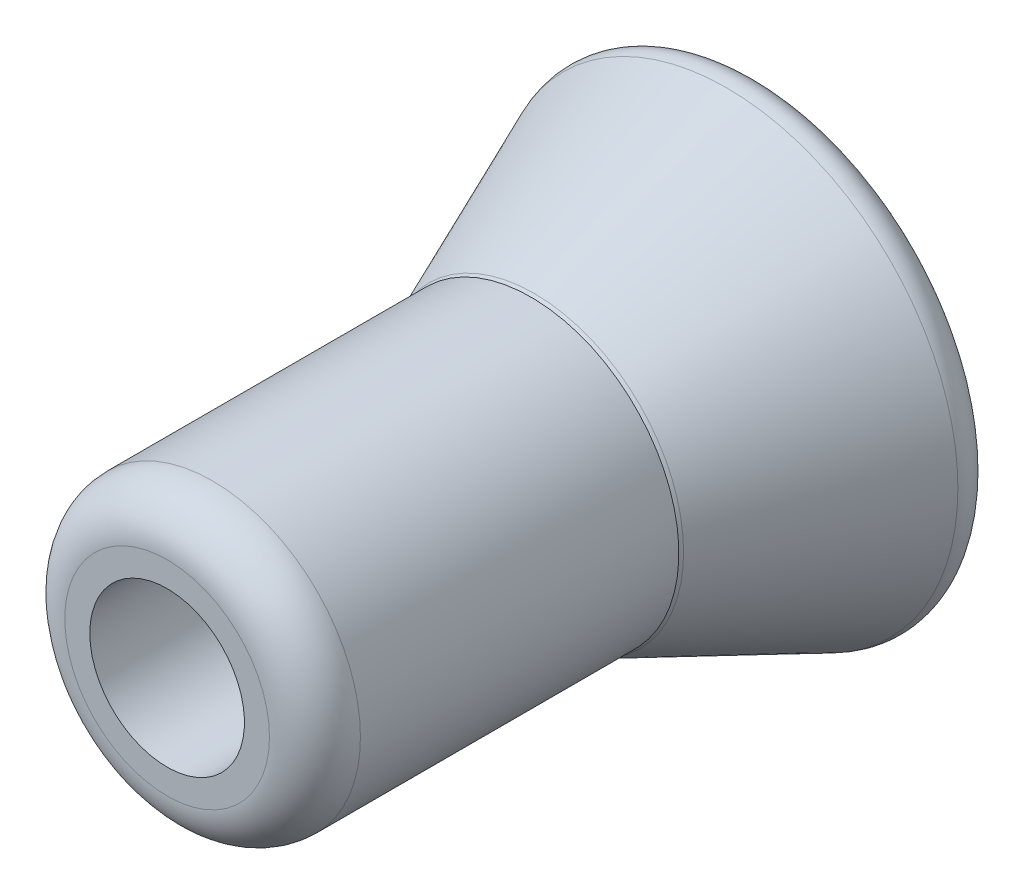
ISO-10303-21;
HEADER;
FILE_DESCRIPTION(('STEP AP214'),'2;1');
FILE_NAME('part.step','',(''),(''),'','','');
FILE_SCHEMA(('AUTOMOTIVE_DESIGN { 1 0 10303 214 1 1 1 1 }'));
ENDSEC;
DATA;
#1=APPLICATION_CONTEXT('core data for automotive mechanical design processes');
#2=APPLICATION_PROTOCOL_DEFINITION('international standard','automotive_design',2000,#1);
#3=PRODUCT_CONTEXT('',#1,'mechanical');
#4=PRODUCT('Part','Part','',(#3));
#5=PRODUCT_RELATED_PRODUCT_CATEGORY('part','',(#4));
#6=PRODUCT_DEFINITION_FORMATION('','',#4);
#7=PRODUCT_DEFINITION_CONTEXT('part definition',#1,'design');
#8=PRODUCT_DEFINITION('design','',#6,#7);
#9=PRODUCT_DEFINITION_SHAPE('','',#8);
#10=(LENGTH_UNIT() NAMED_UNIT(*) SI_UNIT(.MILLI.,.METRE.));
#11=(NAMED_UNIT(*) PLANE_ANGLE_UNIT() SI_UNIT($,.RADIAN.));
#12=(NAMED_UNIT(*) SI_UNIT($,.STERADIAN.) SOLID_ANGLE_UNIT());
#13=UNCERTAINTY_MEASURE_WITH_UNIT(LENGTH_MEASURE(1.E-05),#10,'distance_accuracy_value','');
#14=(GEOMETRIC_REPRESENTATION_CONTEXT(3) GLOBAL_UNCERTAINTY_ASSIGNED_CONTEXT((#13)) GLOBAL_UNIT_ASSIGNED_CONTEXT((#10,
#11,#12)) REPRESENTATION_CONTEXT('',''));
#15=CARTESIAN_POINT('',(0.,0.,0.));
#16=DIRECTION('',(0.,0.,1.));
#17=DIRECTION('',(1.,0.,0.));
#18=AXIS2_PLACEMENT_3D('',#15,#16,#17);
#19=CARTESIAN_POINT('',(0.,0.,13.));
#20=DIRECTION('',(0.,0.,-1.));
#21=DIRECTION('',(-1.,0.,0.));
#22=AXIS2_PLACEMENT_3D('',#19,#20,#21);
#23=CYLINDRICAL_SURFACE('',#22,3.25);
#24=CARTESIAN_POINT('',(0.,0.,12.));
#25=DIRECTION('',(0.,0.,1.));
#26=DIRECTION('',(1.,0.,0.));
#27=AXIS2_PLACEMENT_3D('',#24,#25,#26);
#28=CIRCLE('',#27,3.25);
#29=CARTESIAN_POINT('',(-3.25,0.,12.));
#30=VERTEX_POINT('',#29);
#31=EDGE_CURVE('E52',#30,#30,#28,.F.);
#32=CARTESIAN_POINT('',(0.,0.,5.));
#33=DIRECTION('',(0.,0.,-1.));
#34=DIRECTION('',(-1.,0.,0.));
#35=AXIS2_PLACEMENT_3D('',#32,#33,#34);
#36=CIRCLE('',#35,3.25);
#37=CARTESIAN_POINT('',(-3.25,0.,5.));
#38=VERTEX_POINT('',#37);
#39=EDGE_CURVE('E60',#38,#38,#36,.T.);
#40=CARTESIAN_POINT('',(-3.25,0.,12.));
#41=CARTESIAN_POINT('',(-3.25,0.,11.9270833333333));
#42=CARTESIAN_POINT('',(-3.25,0.,11.8541666666667));
#43=CARTESIAN_POINT('',(-3.25,0.,11.7083333333333));
#44=CARTESIAN_POINT('',(-3.25,0.,11.6354166666667));
#45=CARTESIAN_POINT('',(-3.25,0.,11.4895833333333));
#46=CARTESIAN_POINT('',(-3.25,0.,11.4166666666667));
#47=CARTESIAN_POINT('',(-3.25,0.,11.2708333333333));
#48=CARTESIAN_POINT('',(-3.25,0.,11.1979166666667));
#49=CARTESIAN_POINT('',(-3.25,0.,11.0520833333333));
#50=CARTESIAN_POINT('',(-3.25,0.,10.9791666666667));
#51=CARTESIAN_POINT('',(-3.25,0.,10.8333333333333));
#52=CARTESIAN_POINT('',(-3.25,0.,10.7604166666667));
#53=CARTESIAN_POINT('',(-3.25,0.,10.6145833333333));
#54=CARTESIAN_POINT('',(-3.25,0.,10.5416666666667));
#55=CARTESIAN_POINT('',(-3.25,0.,10.3958333333333));
#56=CARTESIAN_POINT('',(-3.25,0.,10.3229166666667));
#57=CARTESIAN_POINT('',(-3.25,0.,10.1770833333333));
#58=CARTESIAN_POINT('',(-3.25,0.,10.1041666666667));
#59=CARTESIAN_POINT('',(-3.25,0.,9.95833333333333));
#60=CARTESIAN_POINT('',(-3.25,0.,9.88541666666667));
#61=CARTESIAN_POINT('',(-3.25,0.,9.73958333333333));
#62=CARTESIAN_POINT('',(-3.25,0.,9.66666666666667));
#63=CARTESIAN_POINT('',(-3.25,0.,9.52083333333333));
#64=CARTESIAN_POINT('',(-3.25,0.,9.44791666666667));
#65=CARTESIAN_POINT('',(-3.25,0.,9.30208333333333));
#66=CARTESIAN_POINT('',(-3.25,0.,9.22916666666667));
#67=CARTESIAN_POINT('',(-3.25,0.,9.08333333333333));
#68=CARTESIAN_POINT('',(-3.25,0.,9.01041666666667));
#69=CARTESIAN_POINT('',(-3.25,0.,8.86458333333333));
#70=CARTESIAN_POINT('',(-3.25,0.,8.79166666666667));
#71=CARTESIAN_POINT('',(-3.25,0.,8.64583333333333));
#72=CARTESIAN_POINT('',(-3.25,0.,8.57291666666667));
#73=CARTESIAN_POINT('',(-3.25,0.,8.42708333333333));
#74=CARTESIAN_POINT('',(-3.25,0.,8.35416666666667));
#75=CARTESIAN_POINT('',(-3.25,0.,8.20833333333333));
#76=CARTESIAN_POINT('',(-3.25,0.,8.13541666666667));
#77=CARTESIAN_POINT('',(-3.25,0.,7.98958333333333));
#78=CARTESIAN_POINT('',(-3.25,0.,7.91666666666667));
#79=CARTESIAN_POINT('',(-3.25,0.,7.77083333333333));
#80=CARTESIAN_POINT('',(-3.25,0.,7.69791666666667));
#81=CARTESIAN_POINT('',(-3.25,0.,7.55208333333333));
#82=CARTESIAN_POINT('',(-3.25,0.,7.47916666666667));
#83=CARTESIAN_POINT('',(-3.25,0.,7.33333333333333));
#84=CARTESIAN_POINT('',(-3.25,0.,7.26041666666667));
#85=CARTESIAN_POINT('',(-3.25,0.,7.11458333333333));
#86=CARTESIAN_POINT('',(-3.25,0.,7.04166666666667));
#87=CARTESIAN_POINT('',(-3.25,0.,6.89583333333333));
#88=CARTESIAN_POINT('',(-3.25,0.,6.82291666666667));
#89=CARTESIAN_POINT('',(-3.25,0.,6.67708333333333));
#90=CARTESIAN_POINT('',(-3.25,0.,6.60416666666667));
#91=CARTESIAN_POINT('',(-3.25,0.,6.45833333333333));
#92=CARTESIAN_POINT('',(-3.25,0.,6.38541666666667));
#93=CARTESIAN_POINT('',(-3.25,0.,6.23958333333333));
#94=CARTESIAN_POINT('',(-3.25,0.,6.16666666666667));
#95=CARTESIAN_POINT('',(-3.25,0.,6.02083333333333));
#96=CARTESIAN_POINT('',(-3.25,0.,5.94791666666667));
#97=CARTESIAN_POINT('',(-3.25,0.,5.80208333333333));
#98=CARTESIAN_POINT('',(-3.25,0.,5.72916666666667));
#99=CARTESIAN_POINT('',(-3.25,0.,5.58333333333333));
#100=CARTESIAN_POINT('',(-3.25,0.,5.51041666666667));
#101=CARTESIAN_POINT('',(-3.25,0.,5.36458333333333));
#102=CARTESIAN_POINT('',(-3.25,0.,5.29166666666667));
#103=CARTESIAN_POINT('',(-3.25,0.,5.14583333333333));
#104=CARTESIAN_POINT('',(-3.25,0.,5.07291666666667));
#105=CARTESIAN_POINT('',(-3.25,0.,5.));
#106=B_SPLINE_CURVE_WITH_KNOTS('',3,(#40,#41,#42,#43,#44,#45,#46,#47,#48,#49,#50,#51,#52,#53,
#54,#55,#56,#57,#58,#59,#60,#61,#62,#63,#64,#65,#66,#67,#68,#69,#70,#71,#72,#73,#74,#75,#76,#77,
#78,#79,#80,#81,#82,#83,#84,#85,#86,#87,#88,#89,#90,#91,#92,#93,#94,#95,#96,#97,#98,#99,#100,
#101,#102,#103,#104,#105),.UNSPECIFIED.,.F.,.F.,(4,2,2,2,2,2,2,2,2,2,2,2,2,2,2,2,2,2,2,2,2,2,2,
2,2,2,2,2,2,2,2,2,4),(0.,0.218749999999998,0.437499999999999,0.656249999999999,
0.874999999999999,1.09375,1.3125,1.53125,1.75,1.96875,2.1875,2.40625,2.625,2.84375,3.0625,
3.28125,3.5,3.71875,3.9375,4.15625,4.375,4.59375,4.8125,5.03125,5.25,5.46875,5.6875,5.90625,
6.125,6.34375,6.5625,6.78125,7.),.UNSPECIFIED.);
#107=EDGE_CURVE('BSEAM37',#30,#38,#106,.T.);
#108=ORIENTED_EDGE('',*,*,#31,.T.);
#109=ORIENTED_EDGE('',*,*,#39,.F.);
#110=ORIENTED_EDGE('',*,*,#107,.T.);
#111=ORIENTED_EDGE('',*,*,#107,.F.);
#112=EDGE_LOOP('',(#108,#110,#109,#111));
#113=FACE_BOUND('',#112,.T.);
#114=ADVANCED_FACE('F37',(#113),#23,.T.);
#115=CARTESIAN_POINT('',(0.,0.,13.));
#116=DIRECTION('',(0.,0.,1.));
#117=DIRECTION('',(1.,0.,0.));
#118=AXIS2_PLACEMENT_3D('',#115,#116,#117);
#119=PLANE('',#118);
#120=CARTESIAN_POINT('',(0.,0.,13.));
#121=DIRECTION('',(0.,0.,1.));
#122=DIRECTION('',(1.,0.,0.));
#123=AXIS2_PLACEMENT_3D('',#120,#121,#122);
#124=CIRCLE('',#123,2.25);
#125=CARTESIAN_POINT('',(2.25,0.,13.));
#126=VERTEX_POINT('',#125);
#127=EDGE_CURVE('E57',#126,#126,#124,.T.);
#128=ORIENTED_EDGE('',*,*,#127,.T.);
#129=EDGE_LOOP('',(#128));
#130=FACE_BOUND('',#129,.T.);
#131=CARTESIAN_POINT('',(0.,0.,13.));
#132=DIRECTION('',(0.,0.,-1.));
#133=DIRECTION('',(-1.,0.,0.));
#134=AXIS2_PLACEMENT_3D('',#131,#132,#133);
#135=CIRCLE('',#134,1.7);
#136=CARTESIAN_POINT('',(-1.7,0.,13.));
#137=VERTEX_POINT('',#136);
#138=EDGE_CURVE('E63',#137,#137,#135,.T.);
#139=ORIENTED_EDGE('',*,*,#138,.T.);
#140=EDGE_LOOP('',(#139));
#141=FACE_BOUND('',#140,.T.);
#142=ADVANCED_FACE('F70',(#130,#141),#119,.T.);
#143=CARTESIAN_POINT('',(0.,0.,0.));
#144=DIRECTION('',(0.,0.,-1.));
#145=DIRECTION('',(-1.,0.,0.));
#146=AXIS2_PLACEMENT_3D('',#143,#144,#145);
#147=CONICAL_SURFACE('',#146,5.37575896824603,0.401425727958697);
#148=CARTESIAN_POINT('',(0.,0.,4.92860890874563));
#149=DIRECTION('',(0.,0.,-1.));
#150=DIRECTION('',(-1.,0.,0.));
#151=AXIS2_PLACEMENT_3D('',#148,#149,#150);
#152=CIRCLE('',#151,3.2836886075372);
#153=CARTESIAN_POINT('',(-3.2836886075372,0.,4.92860890874563));
#154=VERTEX_POINT('',#153);
#155=EDGE_CURVE('E10',#154,#154,#152,.T.);
#156=ORIENTED_EDGE('',*,*,#155,.T.);
#157=EDGE_LOOP('',(#156));
#158=FACE_BOUND('',#157,.T.);
#159=CARTESIAN_POINT('',(0.,0.,0.695365564244637));
#160=DIRECTION('',(0.,0.,-1.));
#161=DIRECTION('',(-1.,0.,0.));
#162=AXIS2_PLACEMENT_3D('',#159,#160,#161);
#163=CIRCLE('',#162,5.08059379816479);
#164=CARTESIAN_POINT('',(-5.08059379816479,0.,0.695365564244637));
#165=VERTEX_POINT('',#164);
#166=EDGE_CURVE('E44',#165,#165,#163,.F.);
#167=ORIENTED_EDGE('',*,*,#166,.T.);
#168=EDGE_LOOP('',(#167));
#169=FACE_BOUND('',#168,.T.);
#170=ADVANCED_FACE('F81',(#158,#169),#147,.T.);
#171=CARTESIAN_POINT('',(0.,0.,0.));
#172=DIRECTION('',(0.,0.,1.));
#173=DIRECTION('',(1.,0.,0.));
#174=AXIS2_PLACEMENT_3D('',#171,#172,#173);
#175=PLANE('',#174);
#176=CARTESIAN_POINT('',(0.,0.,0.));
#177=DIRECTION('',(0.,0.,1.));
#178=DIRECTION('',(1.,0.,0.));
#179=AXIS2_PLACEMENT_3D('',#176,#177,#178);
#180=CIRCLE('',#179,4.62034137143857);
#181=CARTESIAN_POINT('',(4.62034137143857,0.,0.));
#182=VERTEX_POINT('',#181);
#183=EDGE_CURVE('E48',#182,#182,#180,.F.);
#184=ORIENTED_EDGE('',*,*,#183,.T.);
#185=EDGE_LOOP('',(#184));
#186=FACE_BOUND('',#185,.T.);
#187=CARTESIAN_POINT('',(0.,0.,0.));
#188=DIRECTION('',(0.,0.,-1.));
#189=DIRECTION('',(-1.,0.,0.));
#190=AXIS2_PLACEMENT_3D('',#187,#188,#189);
#191=CIRCLE('',#190,1.7);
#192=CARTESIAN_POINT('',(-1.7,0.,0.));
#193=VERTEX_POINT('',#192);
#194=EDGE_CURVE('E64',#193,#193,#191,.T.);
#195=ORIENTED_EDGE('',*,*,#194,.F.);
#196=EDGE_LOOP('',(#195));
#197=FACE_BOUND('',#196,.T.);
#198=ADVANCED_FACE('F76',(#186,#197),#175,.F.);
#199=CARTESIAN_POINT('',(0.,0.,13.));
#200=DIRECTION('',(0.,0.,-1.));
#201=DIRECTION('',(-1.,0.,0.));
#202=AXIS2_PLACEMENT_3D('',#199,#200,#201);
#203=CYLINDRICAL_SURFACE('',#202,1.7);
#204=CARTESIAN_POINT('',(-1.7,0.,13.));
#205=CARTESIAN_POINT('',(-1.7,0.,12.8645833333333));
#206=CARTESIAN_POINT('',(-1.7,0.,12.7291666666667));
#207=CARTESIAN_POINT('',(-1.7,0.,12.4583333333333));
#208=CARTESIAN_POINT('',(-1.7,0.,12.3229166666667));
#209=CARTESIAN_POINT('',(-1.7,0.,12.0520833333333));
#210=CARTESIAN_POINT('',(-1.7,0.,11.9166666666667));
#211=CARTESIAN_POINT('',(-1.7,0.,11.6458333333333));
#212=CARTESIAN_POINT('',(-1.7,0.,11.5104166666667));
#213=CARTESIAN_POINT('',(-1.7,0.,11.2395833333333));
#214=CARTESIAN_POINT('',(-1.7,0.,11.1041666666667));
#215=CARTESIAN_POINT('',(-1.7,0.,10.8333333333333));
#216=CARTESIAN_POINT('',(-1.7,0.,10.6979166666667));
#217=CARTESIAN_POINT('',(-1.7,0.,10.4270833333333));
#218=CARTESIAN_POINT('',(-1.7,0.,10.2916666666667));
#219=CARTESIAN_POINT('',(-1.7,0.,10.0208333333333));
#220=CARTESIAN_POINT('',(-1.7,0.,9.88541666666667));
#221=CARTESIAN_POINT('',(-1.7,0.,9.61458333333333));
#222=CARTESIAN_POINT('',(-1.7,0.,9.47916666666667));
#223=CARTESIAN_POINT('',(-1.7,0.,9.20833333333333));
#224=CARTESIAN_POINT('',(-1.7,0.,9.07291666666667));
#225=CARTESIAN_POINT('',(-1.7,0.,8.80208333333333));
#226=CARTESIAN_POINT('',(-1.7,0.,8.66666666666667));
#227=CARTESIAN_POINT('',(-1.7,0.,8.39583333333333));
#228=CARTESIAN_POINT('',(-1.7,0.,8.26041666666667));
#229=CARTESIAN_POINT('',(-1.7,0.,7.98958333333333));
#230=CARTESIAN_POINT('',(-1.7,0.,7.85416666666667));
#231=CARTESIAN_POINT('',(-1.7,0.,7.58333333333333));
#232=CARTESIAN_POINT('',(-1.7,0.,7.44791666666667));
#233=CARTESIAN_POINT('',(-1.7,0.,7.17708333333333));
#234=CARTESIAN_POINT('',(-1.7,0.,7.04166666666667));
#235=CARTESIAN_POINT('',(-1.7,0.,6.77083333333333));
#236=CARTESIAN_POINT('',(-1.7,0.,6.63541666666667));
#237=CARTESIAN_POINT('',(-1.7,0.,6.36458333333333));
#238=CARTESIAN_POINT('',(-1.7,0.,6.22916666666667));
#239=CARTESIAN_POINT('',(-1.7,0.,5.95833333333333));
#240=CARTESIAN_POINT('',(-1.7,0.,5.82291666666667));
#241=CARTESIAN_POINT('',(-1.7,0.,5.55208333333333));
#242=CARTESIAN_POINT('',(-1.7,0.,5.41666666666667));
#243=CARTESIAN_POINT('',(-1.7,0.,5.14583333333333));
#244=CARTESIAN_POINT('',(-1.7,0.,5.01041666666667));
#245=CARTESIAN_POINT('',(-1.7,0.,4.73958333333333));
#246=CARTESIAN_POINT('',(-1.7,0.,4.60416666666667));
#247=CARTESIAN_POINT('',(-1.7,0.,4.33333333333333));
#248=CARTESIAN_POINT('',(-1.7,0.,4.19791666666667));
#249=CARTESIAN_POINT('',(-1.7,0.,3.92708333333333));
#250=CARTESIAN_POINT('',(-1.7,0.,3.79166666666667));
#251=CARTESIAN_POINT('',(-1.7,0.,3.52083333333333));
#252=CARTESIAN_POINT('',(-1.7,0.,3.38541666666667));
#253=CARTESIAN_POINT('',(-1.7,0.,3.11458333333333));
#254=CARTESIAN_POINT('',(-1.7,0.,2.97916666666667));
#255=CARTESIAN_POINT('',(-1.7,0.,2.70833333333333));
#256=CARTESIAN_POINT('',(-1.7,0.,2.57291666666667));
#257=CARTESIAN_POINT('',(-1.7,0.,2.30208333333333));
#258=CARTESIAN_POINT('',(-1.7,0.,2.16666666666667));
#259=CARTESIAN_POINT('',(-1.7,0.,1.89583333333333));
#260=CARTESIAN_POINT('',(-1.7,0.,1.76041666666667));
#261=CARTESIAN_POINT('',(-1.7,0.,1.48958333333333));
#262=CARTESIAN_POINT('',(-1.7,0.,1.35416666666667));
#263=CARTESIAN_POINT('',(-1.7,0.,1.08333333333333));
#264=CARTESIAN_POINT('',(-1.7,0.,0.947916666666667));
#265=CARTESIAN_POINT('',(-1.7,0.,0.677083333333334));
#266=CARTESIAN_POINT('',(-1.7,0.,0.541666666666667));
#267=CARTESIAN_POINT('',(-1.7,0.,0.270833333333334));
#268=CARTESIAN_POINT('',(-1.7,0.,0.135416666666667));
#269=CARTESIAN_POINT('',(-1.7,0.,0.));
#270=B_SPLINE_CURVE_WITH_KNOTS('',3,(#204,#205,#206,#207,#208,#209,#210,#211,#212,#213,#214,
#215,#216,#217,#218,#219,#220,#221,#222,#223,#224,#225,#226,#227,#228,#229,#230,#231,#232,#233,
#234,#235,#236,#237,#238,#239,#240,#241,#242,#243,#244,#245,#246,#247,#248,#249,#250,#251,#252,
#253,#254,#255,#256,#257,#258,#259,#260,#261,#262,#263,#264,#265,#266,#267,#268,#269),
.UNSPECIFIED.,.F.,.F.,(4,2,2,2,2,2,2,2,2,2,2,2,2,2,2,2,2,2,2,2,2,2,2,2,2,2,2,2,2,2,2,2,4),(0.,
0.40625,0.812500000000001,1.21875,1.625,2.03125,2.4375,2.84375,3.25,3.65625,4.0625,4.46875,
4.875,5.28125,5.6875,6.09375,6.5,6.90625,7.3125,7.71875,8.125,8.53125,8.9375,9.34375,9.75,
10.15625,10.5625,10.96875,11.375,11.78125,12.1875,12.59375,13.),.UNSPECIFIED.);
#271=EDGE_CURVE('BSEAM72',#137,#193,#270,.T.);
#272=ORIENTED_EDGE('',*,*,#138,.F.);
#273=ORIENTED_EDGE('',*,*,#194,.T.);
#274=ORIENTED_EDGE('',*,*,#271,.T.);
#275=ORIENTED_EDGE('',*,*,#271,.F.);
#276=EDGE_LOOP('',(#272,#274,#273,#275));
#277=FACE_BOUND('',#276,.T.);
#278=ADVANCED_FACE('F72',(#277),#203,.F.);
#279=CARTESIAN_POINT('',(0.,0.,12.));
#280=DIRECTION('',(0.,0.,1.));
#281=DIRECTION('',(1.,0.,0.));
#282=AXIS2_PLACEMENT_3D('',#279,#280,#281);
#283=TOROIDAL_SURFACE('',#282,2.25,1.);
#284=ORIENTED_EDGE('',*,*,#31,.F.);
#285=EDGE_LOOP('',(#284));
#286=FACE_BOUND('',#285,.T.);
#287=ORIENTED_EDGE('',*,*,#127,.F.);
#288=EDGE_LOOP('',(#287));
#289=FACE_BOUND('',#288,.T.);
#290=ADVANCED_FACE('F75',(#286,#289),#283,.T.);
#291=CARTESIAN_POINT('',(0.,0.,0.5));
#292=DIRECTION('',(0.,0.,1.));
#293=DIRECTION('',(1.,0.,0.));
#294=AXIS2_PLACEMENT_3D('',#291,#292,#293);
#295=TOROIDAL_SURFACE('',#294,4.62034137143857,0.5);
#296=ORIENTED_EDGE('',*,*,#166,.F.);
#297=EDGE_LOOP('',(#296));
#298=FACE_BOUND('',#297,.T.);
#299=ORIENTED_EDGE('',*,*,#183,.F.);
#300=EDGE_LOOP('',(#299));
#301=FACE_BOUND('',#300,.T.);
#302=ADVANCED_FACE('F100',(#298,#301),#295,.T.);
#303=CARTESIAN_POINT('',(0.,0.,4.53787778025635));
#304=DIRECTION('',(0.,0.,1.));
#305=DIRECTION('',(1.,0.,0.));
#306=AXIS2_PLACEMENT_3D('',#303,#304,#305);
#307=TOROIDAL_SURFACE('',#306,2.36318375408476,1.);
#308=ORIENTED_EDGE('',*,*,#39,.T.);
#309=EDGE_LOOP('',(#308));
#310=FACE_BOUND('',#309,.T.);
#311=ORIENTED_EDGE('',*,*,#155,.F.);
#312=EDGE_LOOP('',(#311));
#313=FACE_BOUND('',#312,.T.);
#314=ADVANCED_FACE('F39',(#310,#313),#307,.T.);
#315=CLOSED_SHELL('',(#114,#142,#170,#198,#278,#290,#302,#314));
#316=MANIFOLD_SOLID_BREP('B2',#315);
#317=ADVANCED_BREP_SHAPE_REPRESENTATION('',(#18,#316),#14);
#318=SHAPE_DEFINITION_REPRESENTATION(#9,#317);
ENDSEC;
END-ISO-10303-21;
